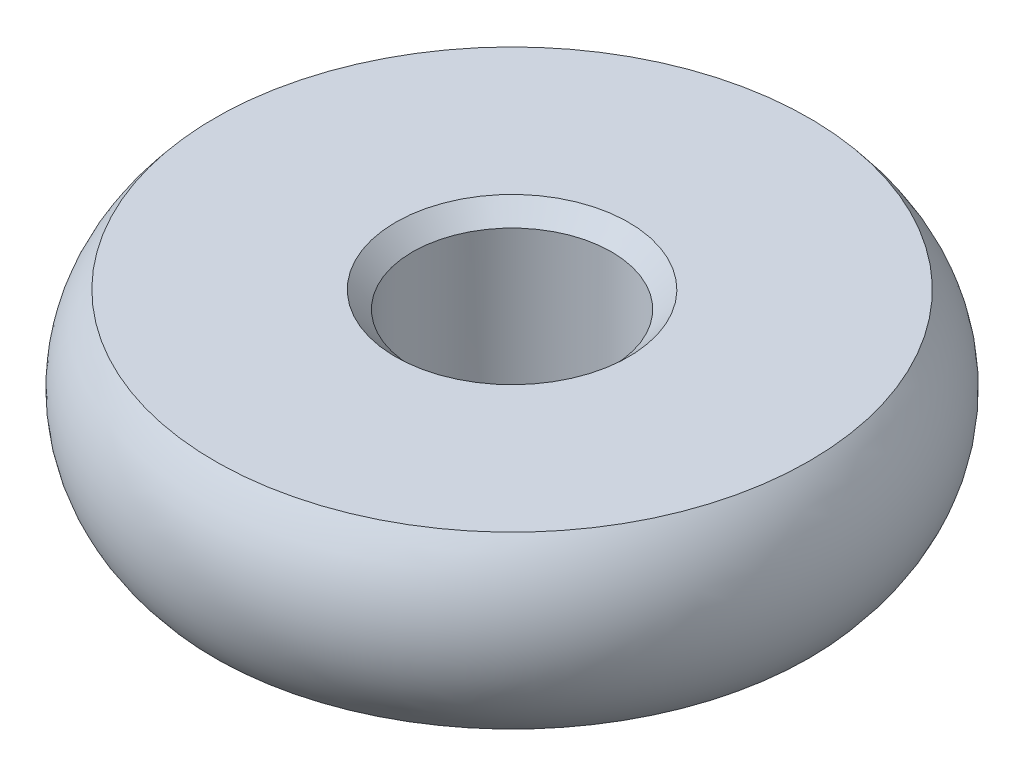
ISO-10303-21;
HEADER;
FILE_DESCRIPTION(('STEP AP214'),'2;1');
FILE_NAME('part.step','',(''),(''),'','','');
FILE_SCHEMA(('AUTOMOTIVE_DESIGN { 1 0 10303 214 1 1 1 1 }'));
ENDSEC;
DATA;
#1=APPLICATION_CONTEXT('core data for automotive mechanical design processes');
#2=APPLICATION_PROTOCOL_DEFINITION('international standard','automotive_design',2000,#1);
#3=PRODUCT_CONTEXT('',#1,'mechanical');
#4=PRODUCT('Part','Part','',(#3));
#5=PRODUCT_RELATED_PRODUCT_CATEGORY('part','',(#4));
#6=PRODUCT_DEFINITION_FORMATION('','',#4);
#7=PRODUCT_DEFINITION_CONTEXT('part definition',#1,'design');
#8=PRODUCT_DEFINITION('design','',#6,#7);
#9=PRODUCT_DEFINITION_SHAPE('','',#8);
#10=(LENGTH_UNIT() NAMED_UNIT(*) SI_UNIT(.MILLI.,.METRE.));
#11=(NAMED_UNIT(*) PLANE_ANGLE_UNIT() SI_UNIT($,.RADIAN.));
#12=(NAMED_UNIT(*) SI_UNIT($,.STERADIAN.) SOLID_ANGLE_UNIT());
#13=UNCERTAINTY_MEASURE_WITH_UNIT(LENGTH_MEASURE(1.E-05),#10,'distance_accuracy_value','');
#14=(GEOMETRIC_REPRESENTATION_CONTEXT(3) GLOBAL_UNCERTAINTY_ASSIGNED_CONTEXT((#13)) GLOBAL_UNIT_ASSIGNED_CONTEXT((#10,
#11,#12)) REPRESENTATION_CONTEXT('',''));
#15=CARTESIAN_POINT('',(0.,0.,0.));
#16=DIRECTION('',(0.,0.,1.));
#17=DIRECTION('',(1.,0.,0.));
#18=AXIS2_PLACEMENT_3D('',#15,#16,#17);
#19=CARTESIAN_POINT('',(17.5,14.9999999999999,0.));
#20=DIRECTION('',(0.,1.,0.));
#21=DIRECTION('',(-1.,0.,0.));
#22=AXIS2_PLACEMENT_3D('',#19,#20,#21);
#23=PLANE('',#22);
#24=CARTESIAN_POINT('',(0.,14.9999999999999,0.));
#25=DIRECTION('',(0.,1.,0.));
#26=DIRECTION('',(-1.,0.,0.));
#27=AXIS2_PLACEMENT_3D('',#24,#25,#26);
#28=CIRCLE('',#27,20.5000000000001);
#29=CARTESIAN_POINT('',(-20.5000000000002,14.9999999999998,0.));
#30=VERTEX_POINT('',#29);
#31=EDGE_CURVE('E48',#30,#30,#28,.F.);
#32=ORIENTED_EDGE('',*,*,#31,.T.);
#33=EDGE_LOOP('',(#32));
#34=FACE_BOUND('',#33,.T.);
#35=CARTESIAN_POINT('',(0.,14.9999999999998,0.));
#36=DIRECTION('',(0.,-1.,0.));
#37=DIRECTION('',(1.,0.,0.));
#38=AXIS2_PLACEMENT_3D('',#35,#36,#37);
#39=CIRCLE('',#38,52.2705098312485);
#40=CARTESIAN_POINT('',(52.2705098312484,15.,0.));
#41=VERTEX_POINT('',#40);
#42=EDGE_CURVE('E53',#41,#41,#39,.T.);
#43=ORIENTED_EDGE('',*,*,#42,.F.);
#44=EDGE_LOOP('',(#43));
#45=FACE_BOUND('',#44,.T.);
#46=ADVANCED_FACE('F32',(#34,#45),#23,.T.);
#47=CARTESIAN_POINT('',(0.,-1.11022302462516E-13,0.));
#48=DIRECTION('',(0.,-1.,0.));
#49=DIRECTION('',(1.,0.,0.));
#50=AXIS2_PLACEMENT_3D('',#47,#48,#49);
#51=TOROIDAL_SURFACE('',#50,35.5,22.5);
#52=ORIENTED_EDGE('',*,*,#42,.T.);
#53=EDGE_LOOP('',(#52));
#54=FACE_BOUND('',#53,.T.);
#55=CARTESIAN_POINT('',(0.,-15.0000000000002,0.));
#56=DIRECTION('',(0.,-1.,0.));
#57=DIRECTION('',(1.,0.,0.));
#58=AXIS2_PLACEMENT_3D('',#55,#56,#57);
#59=CIRCLE('',#58,52.2705098312484);
#60=CARTESIAN_POINT('',(52.2705098312484,-15.0000000000001,0.));
#61=VERTEX_POINT('',#60);
#62=EDGE_CURVE('E56',#61,#61,#59,.T.);
#63=ORIENTED_EDGE('',*,*,#62,.F.);
#64=EDGE_LOOP('',(#63));
#65=FACE_BOUND('',#64,.T.);
#66=ADVANCED_FACE('F62',(#54,#65),#51,.T.);
#67=CARTESIAN_POINT('',(17.5,-15.0000000000001,0.));
#68=DIRECTION('',(0.,-1.,0.));
#69=DIRECTION('',(1.,0.,0.));
#70=AXIS2_PLACEMENT_3D('',#67,#68,#69);
#71=PLANE('',#70);
#72=CARTESIAN_POINT('',(0.,-15.0000000000001,0.));
#73=DIRECTION('',(0.,-1.,0.));
#74=DIRECTION('',(1.,0.,0.));
#75=AXIS2_PLACEMENT_3D('',#72,#73,#74);
#76=CIRCLE('',#75,20.5);
#77=CARTESIAN_POINT('',(20.5000000000001,-15.,0.));
#78=VERTEX_POINT('',#77);
#79=EDGE_CURVE('E10',#78,#78,#76,.F.);
#80=ORIENTED_EDGE('',*,*,#79,.T.);
#81=EDGE_LOOP('',(#80));
#82=FACE_BOUND('',#81,.T.);
#83=ORIENTED_EDGE('',*,*,#62,.T.);
#84=EDGE_LOOP('',(#83));
#85=FACE_BOUND('',#84,.T.);
#86=ADVANCED_FACE('F60',(#82,#85),#71,.T.);
#87=CARTESIAN_POINT('',(1.93062209184187E-12,-562.822725833894,0.));
#88=DIRECTION('',(0.,-1.,0.));
#89=DIRECTION('',(1.,0.,0.));
#90=AXIS2_PLACEMENT_3D('',#87,#88,#89);
#91=CYLINDRICAL_SURFACE('',#90,17.5);
#92=CARTESIAN_POINT('',(0.,11.9999999999998,0.));
#93=DIRECTION('',(0.,1.,0.));
#94=DIRECTION('',(-1.,0.,0.));
#95=AXIS2_PLACEMENT_3D('',#92,#93,#94);
#96=CIRCLE('',#95,17.5);
#97=CARTESIAN_POINT('',(-17.5,11.9999999999997,0.));
#98=VERTEX_POINT('',#97);
#99=EDGE_CURVE('E40',#98,#98,#96,.T.);
#100=ORIENTED_EDGE('',*,*,#99,.T.);
#101=EDGE_LOOP('',(#100));
#102=FACE_BOUND('',#101,.T.);
#103=CARTESIAN_POINT('',(0.,-12.0000000000001,0.));
#104=DIRECTION('',(0.,-1.,0.));
#105=DIRECTION('',(1.,0.,0.));
#106=AXIS2_PLACEMENT_3D('',#103,#104,#105);
#107=CIRCLE('',#106,17.5);
#108=CARTESIAN_POINT('',(17.5,-12.0000000000001,0.));
#109=VERTEX_POINT('',#108);
#110=EDGE_CURVE('E44',#109,#109,#107,.T.);
#111=ORIENTED_EDGE('',*,*,#110,.T.);
#112=EDGE_LOOP('',(#111));
#113=FACE_BOUND('',#112,.T.);
#114=ADVANCED_FACE('F70',(#102,#113),#91,.F.);
#115=CARTESIAN_POINT('',(0.,14.9999999999998,0.));
#116=DIRECTION('',(0.,1.,0.));
#117=DIRECTION('',(-1.,0.,0.));
#118=AXIS2_PLACEMENT_3D('',#115,#116,#117);
#119=CONICAL_SURFACE('',#118,20.5,0.785398163397452);
#120=ORIENTED_EDGE('',*,*,#99,.F.);
#121=EDGE_LOOP('',(#120));
#122=FACE_BOUND('',#121,.T.);
#123=ORIENTED_EDGE('',*,*,#31,.F.);
#124=EDGE_LOOP('',(#123));
#125=FACE_BOUND('',#124,.T.);
#126=ADVANCED_FACE('F76',(#122,#125),#119,.F.);
#127=CARTESIAN_POINT('',(0.,-12.0000000000001,0.));
#128=DIRECTION('',(0.,-1.,0.));
#129=DIRECTION('',(1.,0.,0.));
#130=AXIS2_PLACEMENT_3D('',#127,#128,#129);
#131=CONICAL_SURFACE('',#130,17.5,0.785398163397452);
#132=ORIENTED_EDGE('',*,*,#79,.F.);
#133=EDGE_LOOP('',(#132));
#134=FACE_BOUND('',#133,.T.);
#135=ORIENTED_EDGE('',*,*,#110,.F.);
#136=EDGE_LOOP('',(#135));
#137=FACE_BOUND('',#136,.T.);
#138=ADVANCED_FACE('F35',(#134,#137),#131,.F.);
#139=CLOSED_SHELL('',(#46,#66,#86,#114,#126,#138));
#140=MANIFOLD_SOLID_BREP('B2',#139);
#141=ADVANCED_BREP_SHAPE_REPRESENTATION('',(#18,#140),#14);
#142=SHAPE_DEFINITION_REPRESENTATION(#9,#141);
ENDSEC;
END-ISO-10303-21;
